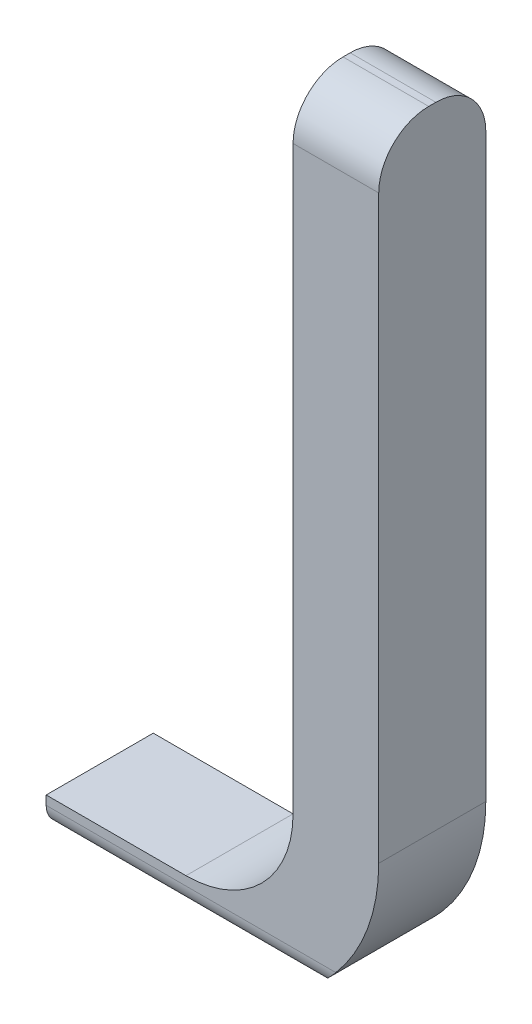
ISO-10303-21;
HEADER;
FILE_DESCRIPTION(('STEP AP214'),'2;1');
FILE_NAME('part.step','',(''),(''),'','','');
FILE_SCHEMA(('AUTOMOTIVE_DESIGN { 1 0 10303 214 1 1 1 1 }'));
ENDSEC;
DATA;
#1=APPLICATION_CONTEXT('core data for automotive mechanical design processes');
#2=APPLICATION_PROTOCOL_DEFINITION('international standard','automotive_design',2000,#1);
#3=PRODUCT_CONTEXT('',#1,'mechanical');
#4=PRODUCT('Part','Part','',(#3));
#5=PRODUCT_RELATED_PRODUCT_CATEGORY('part','',(#4));
#6=PRODUCT_DEFINITION_FORMATION('','',#4);
#7=PRODUCT_DEFINITION_CONTEXT('part definition',#1,'design');
#8=PRODUCT_DEFINITION('design','',#6,#7);
#9=PRODUCT_DEFINITION_SHAPE('','',#8);
#10=(LENGTH_UNIT() NAMED_UNIT(*) SI_UNIT(.MILLI.,.METRE.));
#11=(NAMED_UNIT(*) PLANE_ANGLE_UNIT() SI_UNIT($,.RADIAN.));
#12=(NAMED_UNIT(*) SI_UNIT($,.STERADIAN.) SOLID_ANGLE_UNIT());
#13=UNCERTAINTY_MEASURE_WITH_UNIT(LENGTH_MEASURE(1.E-05),#10,'distance_accuracy_value','');
#14=(GEOMETRIC_REPRESENTATION_CONTEXT(3) GLOBAL_UNCERTAINTY_ASSIGNED_CONTEXT((#13)) GLOBAL_UNIT_ASSIGNED_CONTEXT((#10,
#11,#12)) REPRESENTATION_CONTEXT('',''));
#15=CARTESIAN_POINT('',(0.,0.,0.));
#16=DIRECTION('',(0.,0.,1.));
#17=DIRECTION('',(1.,0.,0.));
#18=AXIS2_PLACEMENT_3D('',#15,#16,#17);
#19=CARTESIAN_POINT('',(81.8142284992855,422.253610620611,-137.52302838531));
#20=DIRECTION('',(-1.,0.,0.));
#21=DIRECTION('',(0.,-1.,0.));
#22=AXIS2_PLACEMENT_3D('',#19,#20,#21);
#23=PLANE('',#22);
#24=DIRECTION('',(0.,1.,0.));
#25=VECTOR('',#24,1.);
#26=CARTESIAN_POINT('',(81.8142284992855,422.253610620611,-15.));
#27=LINE('',#26,#25);
#28=CARTESIAN_POINT('',(81.8142284992855,420.99625130773,-15.));
#29=VERTEX_POINT('',#28);
#30=CARTESIAN_POINT('',(81.8142284992855,422.253610620611,-15.));
#31=VERTEX_POINT('',#30);
#32=EDGE_CURVE('E165',#29,#31,#27,.T.);
#33=ORIENTED_EDGE('',*,*,#32,.F.);
#34=CARTESIAN_POINT('',(81.8142284992855,420.99625130773,-12.));
#35=DIRECTION('',(-1.,0.,0.));
#36=DIRECTION('',(0.,-1.,0.));
#37=AXIS2_PLACEMENT_3D('',#34,#35,#36);
#38=CIRCLE('',#37,3.);
#39=CARTESIAN_POINT('',(81.8142284992855,418.87493096417,-14.1213203435596));
#40=VERTEX_POINT('',#39);
#41=EDGE_CURVE('E132',#29,#40,#38,.T.);
#42=ORIENTED_EDGE('',*,*,#41,.T.);
#43=DIRECTION('',(0.,-0.70710678118654,0.707106781186555));
#44=VECTOR('',#43,1.);
#45=CARTESIAN_POINT('',(81.8142284992855,412.253610620611,-7.50000000000001));
#46=LINE('',#45,#44);
#47=CARTESIAN_POINT('',(81.8142284992855,412.253610620611,-7.50000000000004));
#48=VERTEX_POINT('',#47);
#49=EDGE_CURVE('E128',#40,#48,#46,.T.);
#50=ORIENTED_EDGE('',*,*,#49,.T.);
#51=DIRECTION('',(0.,0.707106781186556,0.707106781186539));
#52=VECTOR('',#51,1.);
#53=CARTESIAN_POINT('',(81.8142284992855,419.753610620611,0.));
#54=LINE('',#53,#52);
#55=CARTESIAN_POINT('',(81.8142284992855,418.874930964171,-0.878679656440316));
#56=VERTEX_POINT('',#55);
#57=EDGE_CURVE('E130',#48,#56,#54,.T.);
#58=ORIENTED_EDGE('',*,*,#57,.T.);
#59=CARTESIAN_POINT('',(81.8142284992855,420.99625130773,-3.));
#60=DIRECTION('',(-1.,0.,0.));
#61=DIRECTION('',(0.,-1.,0.));
#62=AXIS2_PLACEMENT_3D('',#59,#60,#61);
#63=CIRCLE('',#62,3.);
#64=CARTESIAN_POINT('',(81.8142284992855,420.99625130773,0.));
#65=VERTEX_POINT('',#64);
#66=EDGE_CURVE('E49',#56,#65,#63,.T.);
#67=ORIENTED_EDGE('',*,*,#66,.T.);
#68=DIRECTION('',(0.,-1.,0.));
#69=VECTOR('',#68,1.);
#70=CARTESIAN_POINT('',(81.8142284992855,422.253610620611,0.));
#71=LINE('',#70,#69);
#72=CARTESIAN_POINT('',(81.8142284992855,422.253610620611,0.));
#73=VERTEX_POINT('',#72);
#74=EDGE_CURVE('E151',#73,#65,#71,.T.);
#75=ORIENTED_EDGE('',*,*,#74,.F.);
#76=DIRECTION('',(0.,0.,1.));
#77=VECTOR('',#76,1.);
#78=CARTESIAN_POINT('',(81.8142284992855,422.253610620611,-137.52302838531));
#79=LINE('',#78,#77);
#80=EDGE_CURVE('E156',#31,#73,#79,.T.);
#81=ORIENTED_EDGE('',*,*,#80,.F.);
#82=EDGE_LOOP('',(#33,#42,#50,#58,#67,#75,#81));
#83=FACE_BOUND('',#82,.T.);
#84=ADVANCED_FACE('F33',(#83),#23,.T.);
#85=CARTESIAN_POINT('',(81.8142284992855,422.253610620611,-137.52302838531));
#86=DIRECTION('',(0.,1.,0.));
#87=DIRECTION('',(0.,0.,1.));
#88=AXIS2_PLACEMENT_3D('',#85,#86,#87);
#89=PLANE('',#88);
#90=DIRECTION('',(1.,0.,0.));
#91=VECTOR('',#90,1.);
#92=CARTESIAN_POINT('',(81.8142284992855,422.253610620611,-15.));
#93=LINE('',#92,#91);
#94=CARTESIAN_POINT('',(101.396155955386,422.253610620611,-15.));
#95=VERTEX_POINT('',#94);
#96=EDGE_CURVE('E163',#31,#95,#93,.T.);
#97=ORIENTED_EDGE('',*,*,#96,.F.);
#98=ORIENTED_EDGE('',*,*,#80,.T.);
#99=DIRECTION('',(-1.,0.,0.));
#100=VECTOR('',#99,1.);
#101=CARTESIAN_POINT('',(81.8142284992855,422.253610620611,0.));
#102=LINE('',#101,#100);
#103=CARTESIAN_POINT('',(101.396155955386,422.253610620611,0.));
#104=VERTEX_POINT('',#103);
#105=EDGE_CURVE('E179',#104,#73,#102,.T.);
#106=ORIENTED_EDGE('',*,*,#105,.F.);
#107=DIRECTION('',(0.,0.,1.));
#108=VECTOR('',#107,1.);
#109=CARTESIAN_POINT('',(101.396155955386,422.253610620611,-137.52302838531));
#110=LINE('',#109,#108);
#111=EDGE_CURVE('E184',#95,#104,#110,.T.);
#112=ORIENTED_EDGE('',*,*,#111,.F.);
#113=EDGE_LOOP('',(#97,#98,#106,#112));
#114=FACE_BOUND('',#113,.T.);
#115=ADVANCED_FACE('F241',(#114),#89,.T.);
#116=CARTESIAN_POINT('',(101.396155955386,437.253610620611,-137.52302838531));
#117=DIRECTION('',(0.,0.,1.));
#118=DIRECTION('',(1.,0.,0.));
#119=AXIS2_PLACEMENT_3D('',#116,#117,#118);
#120=CYLINDRICAL_SURFACE('',#119,15.);
#121=CARTESIAN_POINT('',(101.396155955386,437.253610620611,-15.));
#122=DIRECTION('',(0.,0.,1.));
#123=DIRECTION('',(1.,0.,0.));
#124=AXIS2_PLACEMENT_3D('',#121,#122,#123);
#125=CIRCLE('',#124,15.);
#126=CARTESIAN_POINT('',(116.396155955386,437.253610620611,-15.));
#127=VERTEX_POINT('',#126);
#128=EDGE_CURVE('E161',#95,#127,#125,.T.);
#129=ORIENTED_EDGE('',*,*,#128,.F.);
#130=ORIENTED_EDGE('',*,*,#111,.T.);
#131=CARTESIAN_POINT('',(101.396155955386,437.253610620611,0.));
#132=DIRECTION('',(0.,0.,-1.));
#133=DIRECTION('',(1.,0.,0.));
#134=AXIS2_PLACEMENT_3D('',#131,#132,#133);
#135=CIRCLE('',#134,15.);
#136=CARTESIAN_POINT('',(116.396155955386,437.253610620611,0.));
#137=VERTEX_POINT('',#136);
#138=EDGE_CURVE('E176',#137,#104,#135,.T.);
#139=ORIENTED_EDGE('',*,*,#138,.F.);
#140=DIRECTION('',(0.,0.,1.));
#141=VECTOR('',#140,1.);
#142=CARTESIAN_POINT('',(116.396155955386,437.253610620611,-137.52302838531));
#143=LINE('',#142,#141);
#144=EDGE_CURVE('E186',#127,#137,#143,.T.);
#145=ORIENTED_EDGE('',*,*,#144,.F.);
#146=EDGE_LOOP('',(#129,#130,#139,#145));
#147=FACE_BOUND('',#146,.T.);
#148=ADVANCED_FACE('F286',(#147),#120,.F.);
#149=CARTESIAN_POINT('',(116.396155955386,437.253610620611,-137.52302838531));
#150=DIRECTION('',(-1.,0.,0.));
#151=DIRECTION('',(0.,0.,1.));
#152=AXIS2_PLACEMENT_3D('',#149,#150,#151);
#153=PLANE('',#152);
#154=DIRECTION('',(0.,0.,1.));
#155=VECTOR('',#154,1.);
#156=CARTESIAN_POINT('',(116.396155955386,525.576232012732,-137.52302838531));
#157=LINE('',#156,#155);
#158=CARTESIAN_POINT('',(116.396155955386,525.576232012732,-8.00000000000001));
#159=VERTEX_POINT('',#158);
#160=CARTESIAN_POINT('',(116.396155955386,525.576232012732,-7.00000000000001));
#161=VERTEX_POINT('',#160);
#162=EDGE_CURVE('E189',#159,#161,#157,.T.);
#163=ORIENTED_EDGE('',*,*,#162,.F.);
#164=CARTESIAN_POINT('',(116.396155955386,518.576232012732,-8.));
#165=DIRECTION('',(-1.,0.,0.));
#166=DIRECTION('',(0.,0.,1.));
#167=AXIS2_PLACEMENT_3D('',#164,#165,#166);
#168=CIRCLE('',#167,7.);
#169=CARTESIAN_POINT('',(116.396155955386,518.576232012732,-15.));
#170=VERTEX_POINT('',#169);
#171=EDGE_CURVE('E209',#159,#170,#168,.T.);
#172=ORIENTED_EDGE('',*,*,#171,.T.);
#173=DIRECTION('',(0.,1.,0.));
#174=VECTOR('',#173,1.);
#175=CARTESIAN_POINT('',(116.396155955386,437.253610620611,-15.));
#176=LINE('',#175,#174);
#177=EDGE_CURVE('E158',#127,#170,#176,.T.);
#178=ORIENTED_EDGE('',*,*,#177,.F.);
#179=ORIENTED_EDGE('',*,*,#144,.T.);
#180=DIRECTION('',(0.,-1.,0.));
#181=VECTOR('',#180,1.);
#182=CARTESIAN_POINT('',(116.396155955386,437.253610620611,0.));
#183=LINE('',#182,#181);
#184=CARTESIAN_POINT('',(116.396155955386,518.576232012732,0.));
#185=VERTEX_POINT('',#184);
#186=EDGE_CURVE('E174',#185,#137,#183,.T.);
#187=ORIENTED_EDGE('',*,*,#186,.F.);
#188=CARTESIAN_POINT('',(116.396155955386,518.576232012732,-7.));
#189=DIRECTION('',(-1.,0.,0.));
#190=DIRECTION('',(0.,0.,1.));
#191=AXIS2_PLACEMENT_3D('',#188,#189,#190);
#192=CIRCLE('',#191,7.);
#193=EDGE_CURVE('E207',#185,#161,#192,.T.);
#194=ORIENTED_EDGE('',*,*,#193,.T.);
#195=EDGE_LOOP('',(#163,#172,#178,#179,#187,#194));
#196=FACE_BOUND('',#195,.T.);
#197=ADVANCED_FACE('F291',(#196),#153,.T.);
#198=CARTESIAN_POINT('',(116.396155955386,525.576232012732,-137.52302838531));
#199=DIRECTION('',(0.,1.,0.));
#200=DIRECTION('',(0.,0.,1.));
#201=AXIS2_PLACEMENT_3D('',#198,#199,#200);
#202=PLANE('',#201);
#203=DIRECTION('',(0.,0.,1.));
#204=VECTOR('',#203,1.);
#205=CARTESIAN_POINT('',(128.396155955386,525.576232012732,-137.52302838531));
#206=LINE('',#205,#204);
#207=CARTESIAN_POINT('',(128.396155955386,525.576232012732,-8.00000000000001));
#208=VERTEX_POINT('',#207);
#209=CARTESIAN_POINT('',(128.396155955386,525.576232012732,-7.00000000000001));
#210=VERTEX_POINT('',#209);
#211=EDGE_CURVE('E192',#208,#210,#206,.T.);
#212=ORIENTED_EDGE('',*,*,#211,.F.);
#213=DIRECTION('',(1.,0.,0.));
#214=VECTOR('',#213,1.);
#215=CARTESIAN_POINT('',(116.396155955386,525.576232012732,-8.));
#216=LINE('',#215,#214);
#217=EDGE_CURVE('E205',#208,#159,#216,.F.);
#218=ORIENTED_EDGE('',*,*,#217,.T.);
#219=ORIENTED_EDGE('',*,*,#162,.T.);
#220=DIRECTION('',(-1.,0.,0.));
#221=VECTOR('',#220,1.);
#222=CARTESIAN_POINT('',(116.396155955386,525.576232012732,-7.00000000000001));
#223=LINE('',#222,#221);
#224=EDGE_CURVE('E203',#161,#210,#223,.F.);
#225=ORIENTED_EDGE('',*,*,#224,.T.);
#226=EDGE_LOOP('',(#212,#218,#219,#225));
#227=FACE_BOUND('',#226,.T.);
#228=ADVANCED_FACE('F295',(#227),#202,.T.);
#229=CARTESIAN_POINT('',(128.396155955386,525.576232012732,-137.52302838531));
#230=DIRECTION('',(1.,0.,0.));
#231=DIRECTION('',(0.,0.,-1.));
#232=AXIS2_PLACEMENT_3D('',#229,#230,#231);
#233=PLANE('',#232);
#234=DIRECTION('',(0.,-1.,0.));
#235=VECTOR('',#234,1.);
#236=CARTESIAN_POINT('',(128.396155955386,525.576232012732,-15.));
#237=LINE('',#236,#235);
#238=CARTESIAN_POINT('',(128.396155955386,518.576232012732,-15.));
#239=VERTEX_POINT('',#238);
#240=CARTESIAN_POINT('',(128.396155955386,437.253610620611,-15.));
#241=VERTEX_POINT('',#240);
#242=EDGE_CURVE('E155',#239,#241,#237,.T.);
#243=ORIENTED_EDGE('',*,*,#242,.F.);
#244=CARTESIAN_POINT('',(128.396155955386,518.576232012732,-8.));
#245=DIRECTION('',(1.,0.,0.));
#246=DIRECTION('',(0.,0.,-1.));
#247=AXIS2_PLACEMENT_3D('',#244,#245,#246);
#248=CIRCLE('',#247,7.);
#249=EDGE_CURVE('E201',#239,#208,#248,.T.);
#250=ORIENTED_EDGE('',*,*,#249,.T.);
#251=ORIENTED_EDGE('',*,*,#211,.T.);
#252=CARTESIAN_POINT('',(128.396155955386,518.576232012732,-7.));
#253=DIRECTION('',(1.,0.,0.));
#254=DIRECTION('',(0.,0.,-1.));
#255=AXIS2_PLACEMENT_3D('',#252,#253,#254);
#256=CIRCLE('',#255,7.);
#257=CARTESIAN_POINT('',(128.396155955386,518.576232012732,0.));
#258=VERTEX_POINT('',#257);
#259=EDGE_CURVE('E199',#210,#258,#256,.T.);
#260=ORIENTED_EDGE('',*,*,#259,.T.);
#261=DIRECTION('',(0.,1.,0.));
#262=VECTOR('',#261,1.);
#263=CARTESIAN_POINT('',(128.396155955386,525.576232012732,0.));
#264=LINE('',#263,#262);
#265=CARTESIAN_POINT('',(128.396155955386,437.253610620611,0.));
#266=VERTEX_POINT('',#265);
#267=EDGE_CURVE('E171',#266,#258,#264,.T.);
#268=ORIENTED_EDGE('',*,*,#267,.F.);
#269=DIRECTION('',(0.,0.,1.));
#270=VECTOR('',#269,1.);
#271=CARTESIAN_POINT('',(128.396155955386,437.253610620611,-137.52302838531));
#272=LINE('',#271,#270);
#273=EDGE_CURVE('E182',#241,#266,#272,.T.);
#274=ORIENTED_EDGE('',*,*,#273,.F.);
#275=EDGE_LOOP('',(#243,#250,#251,#260,#268,#274));
#276=FACE_BOUND('',#275,.T.);
#277=ADVANCED_FACE('F235',(#276),#233,.T.);
#278=CARTESIAN_POINT('',(103.396155955386,437.253610620611,-137.52302838531));
#279=DIRECTION('',(0.,0.,1.));
#280=DIRECTION('',(1.,0.,0.));
#281=AXIS2_PLACEMENT_3D('',#278,#279,#280);
#282=CYLINDRICAL_SURFACE('',#281,25.);
#283=CARTESIAN_POINT('',(103.396155955386,437.253610620611,-32.5000000000006));
#284=DIRECTION('',(0.,0.707106781186555,0.70710678118654));
#285=DIRECTION('',(0.,-0.70710678118654,0.707106781186555));
#286=AXIS2_PLACEMENT_3D('',#283,#284,#285);
#287=ELLIPSE('',#286,35.3553390593278,25.);
#288=CARTESIAN_POINT('',(120.343844118848,418.87493096417,-14.1213203435596));
#289=VERTEX_POINT('',#288);
#290=CARTESIAN_POINT('',(103.396155955386,412.253610620611,-7.5));
#291=VERTEX_POINT('',#290);
#292=EDGE_CURVE('E142',#289,#291,#287,.F.);
#293=ORIENTED_EDGE('',*,*,#292,.F.);
#294=CARTESIAN_POINT('',(120.343844118848,418.87493096417,-14.1213203435596));
#295=CARTESIAN_POINT('',(120.422091551165,418.94707406357,-14.1934144614544));
#296=CARTESIAN_POINT('',(120.50212729168,419.021813648313,-14.2608483073836));
#297=CARTESIAN_POINT('',(120.664792361866,419.175817361876,-14.3866186818955));
#298=CARTESIAN_POINT('',(120.747419430572,419.255077593239,-14.4449628898315));
#299=CARTESIAN_POINT('',(120.912678346348,419.415883894951,-14.5517729762806));
#300=CARTESIAN_POINT('',(120.995274138985,419.497347792709,-14.6004195298351));
#301=CARTESIAN_POINT('',(121.161524265649,419.663684191045,-14.6894551441593));
#302=CARTESIAN_POINT('',(121.245178893337,419.748557652092,-14.7298418583546));
#303=CARTESIAN_POINT('',(121.416768399598,419.925212895659,-14.8040084744509));
#304=CARTESIAN_POINT('',(121.504725548453,420.017133467035,-14.8374063405176));
#305=CARTESIAN_POINT('',(121.680592409751,420.20380610309,-14.8950943683913));
#306=CARTESIAN_POINT('',(121.768502126953,420.298557788719,-14.9193857435899));
#307=CARTESIAN_POINT('',(121.945732350175,420.492619185792,-14.9591193133807));
#308=CARTESIAN_POINT('',(122.03504049277,420.591983436161,-14.9743516670095));
#309=CARTESIAN_POINT('',(122.212577555019,420.792737261583,-14.9947857189091));
#310=CARTESIAN_POINT('',(122.30080613911,420.894127441808,-14.999984373324));
#311=CARTESIAN_POINT('',(122.388213984254,420.99625130773,-15.));
#312=B_SPLINE_CURVE_WITH_KNOTS('',3,(#294,#295,#296,#297,#298,#299,#300,#301,#302,#303,#304,
#305,#306,#307,#308,#309,#310,#311),.UNSPECIFIED.,.F.,.F.,(4,2,2,2,2,2,2,2,4),(0.,
0.38542585859057,0.770524304530041,1.14758954697053,1.52476176319408,1.91901510669598,
2.31321589934118,2.71622421047217,3.11935476032534),.UNSPECIFIED.);
#313=CARTESIAN_POINT('',(122.388213984254,420.99625130773,-15.));
#314=VERTEX_POINT('',#313);
#315=EDGE_CURVE('E223',#289,#314,#312,.T.);
#316=ORIENTED_EDGE('',*,*,#315,.T.);
#317=CARTESIAN_POINT('',(103.396155955386,437.253610620611,-15.));
#318=DIRECTION('',(0.,0.,1.));
#319=DIRECTION('',(1.,0.,0.));
#320=AXIS2_PLACEMENT_3D('',#317,#318,#319);
#321=CIRCLE('',#320,25.);
#322=EDGE_CURVE('E152',#241,#314,#321,.F.);
#323=ORIENTED_EDGE('',*,*,#322,.F.);
#324=ORIENTED_EDGE('',*,*,#273,.T.);
#325=CARTESIAN_POINT('',(103.396155955386,437.253610620611,0.));
#326=DIRECTION('',(0.,0.,1.));
#327=DIRECTION('',(1.,0.,0.));
#328=AXIS2_PLACEMENT_3D('',#325,#326,#327);
#329=CIRCLE('',#328,25.);
#330=CARTESIAN_POINT('',(122.388213984254,420.99625130773,0.));
#331=VERTEX_POINT('',#330);
#332=EDGE_CURVE('E169',#331,#266,#329,.T.);
#333=ORIENTED_EDGE('',*,*,#332,.F.);
#334=CARTESIAN_POINT('',(122.388213984254,420.99625130773,0.));
#335=CARTESIAN_POINT('',(122.304881376789,420.898896373751,-1.7211894640786E-05));
#336=CARTESIAN_POINT('',(122.220845912823,420.802246638457,-0.00473827235102295));
#337=CARTESIAN_POINT('',(122.051777846089,420.610772334439,-0.0233107320381378));
#338=CARTESIAN_POINT('',(121.966745620989,420.515947108232,-0.037158776340752));
#339=CARTESIAN_POINT('',(121.714311444924,420.238718551684,-0.0912041156420113));
#340=CARTESIAN_POINT('',(121.545988817463,420.059384167755,-0.143934864961261));
#341=CARTESIAN_POINT('',(121.290518123,419.794859639435,-0.249311856634872));
#342=CARTESIAN_POINT('',(121.202726330052,419.705351736278,-0.29014129964349));
#343=CARTESIAN_POINT('',(121.02818442759,419.529986768273,-0.380876989631308));
#344=CARTESIAN_POINT('',(120.941434073168,419.444128832515,-0.430781056169584));
#345=CARTESIAN_POINT('',(120.767782787667,419.274689895902,-0.540998614992854));
#346=CARTESIAN_POINT('',(120.680921593347,419.19120229232,-0.601519320580185));
#347=CARTESIAN_POINT('',(120.510000905117,419.029167475093,-0.732538794598721));
#348=CARTESIAN_POINT('',(120.425943873908,418.950624552975,-0.803046062582943));
#349=CARTESIAN_POINT('',(120.343844118848,418.874930964171,-0.878679656440309));
#350=B_SPLINE_CURVE_WITH_KNOTS('',3,(#334,#335,#336,#337,#338,#339,#340,#341,#342,#343,#344,
#345,#346,#347,#348,#349),.UNSPECIFIED.,.F.,.F.,(4,2,2,2,2,2,2,4),(0.,0.384213151240646,
0.768285150797808,1.5200595974459,1.91534954546888,2.3105446388446,2.71454774935435,
3.11889679605043),.UNSPECIFIED.);
#351=CARTESIAN_POINT('',(120.343844118848,418.874930964171,-0.878679656440333));
#352=VERTEX_POINT('',#351);
#353=EDGE_CURVE('E216',#331,#352,#350,.T.);
#354=ORIENTED_EDGE('',*,*,#353,.T.);
#355=CARTESIAN_POINT('',(103.396155955386,437.253610620611,17.4999999999994));
#356=DIRECTION('',(0.,0.707106781186539,-0.707106781186556));
#357=DIRECTION('',(0.,0.707106781186556,0.707106781186539));
#358=AXIS2_PLACEMENT_3D('',#355,#356,#357);
#359=ELLIPSE('',#358,35.355339059327,25.);
#360=EDGE_CURVE('E149',#291,#352,#359,.F.);
#361=ORIENTED_EDGE('',*,*,#360,.F.);
#362=EDGE_LOOP('',(#293,#316,#323,#324,#333,#354,#361));
#363=FACE_BOUND('',#362,.T.);
#364=ADVANCED_FACE('F229',(#363),#282,.T.);
#365=CARTESIAN_POINT('',(103.396155955386,437.253610620611,0.));
#366=DIRECTION('',(0.,0.,1.));
#367=DIRECTION('',(1.,0.,0.));
#368=AXIS2_PLACEMENT_3D('',#365,#366,#367);
#369=PLANE('',#368);
#370=ORIENTED_EDGE('',*,*,#74,.T.);
#371=DIRECTION('',(1.,0.,0.));
#372=VECTOR('',#371,1.);
#373=CARTESIAN_POINT('',(121.249727026744,420.99625130773,0.));
#374=LINE('',#373,#372);
#375=EDGE_CURVE('E42',#65,#331,#374,.T.);
#376=ORIENTED_EDGE('',*,*,#375,.T.);
#377=ORIENTED_EDGE('',*,*,#332,.T.);
#378=ORIENTED_EDGE('',*,*,#267,.T.);
#379=DIRECTION('',(-1.,0.,0.));
#380=VECTOR('',#379,1.);
#381=CARTESIAN_POINT('',(103.396155955386,518.576232012732,0.));
#382=LINE('',#381,#380);
#383=EDGE_CURVE('E211',#258,#185,#382,.T.);
#384=ORIENTED_EDGE('',*,*,#383,.T.);
#385=ORIENTED_EDGE('',*,*,#186,.T.);
#386=ORIENTED_EDGE('',*,*,#138,.T.);
#387=ORIENTED_EDGE('',*,*,#105,.T.);
#388=EDGE_LOOP('',(#370,#376,#377,#378,#384,#385,#386,#387));
#389=FACE_BOUND('',#388,.T.);
#390=ADVANCED_FACE('F234',(#389),#369,.T.);
#391=CARTESIAN_POINT('',(0.,0.,-15.));
#392=DIRECTION('',(0.,0.,1.));
#393=DIRECTION('',(1.,0.,0.));
#394=AXIS2_PLACEMENT_3D('',#391,#392,#393);
#395=PLANE('',#394);
#396=ORIENTED_EDGE('',*,*,#322,.T.);
#397=DIRECTION('',(1.,0.,0.));
#398=VECTOR('',#397,1.);
#399=CARTESIAN_POINT('',(0.,420.99625130773,-15.));
#400=LINE('',#399,#398);
#401=EDGE_CURVE('E261',#314,#29,#400,.F.);
#402=ORIENTED_EDGE('',*,*,#401,.T.);
#403=ORIENTED_EDGE('',*,*,#32,.T.);
#404=ORIENTED_EDGE('',*,*,#96,.T.);
#405=ORIENTED_EDGE('',*,*,#128,.T.);
#406=ORIENTED_EDGE('',*,*,#177,.T.);
#407=DIRECTION('',(1.,0.,0.));
#408=VECTOR('',#407,1.);
#409=CARTESIAN_POINT('',(128.396155955386,518.576232012732,-15.));
#410=LINE('',#409,#408);
#411=EDGE_CURVE('E167',#170,#239,#410,.T.);
#412=ORIENTED_EDGE('',*,*,#411,.T.);
#413=ORIENTED_EDGE('',*,*,#242,.T.);
#414=EDGE_LOOP('',(#396,#402,#403,#404,#405,#406,#412,#413));
#415=FACE_BOUND('',#414,.T.);
#416=ADVANCED_FACE('F246',(#415),#395,.F.);
#417=CARTESIAN_POINT('',(0.,518.576232012732,-8.));
#418=DIRECTION('',(-1.,0.,0.));
#419=DIRECTION('',(0.,0.,1.));
#420=AXIS2_PLACEMENT_3D('',#417,#418,#419);
#421=CYLINDRICAL_SURFACE('',#420,7.);
#422=ORIENTED_EDGE('',*,*,#171,.F.);
#423=ORIENTED_EDGE('',*,*,#217,.F.);
#424=ORIENTED_EDGE('',*,*,#249,.F.);
#425=ORIENTED_EDGE('',*,*,#411,.F.);
#426=EDGE_LOOP('',(#422,#423,#424,#425));
#427=FACE_BOUND('',#426,.T.);
#428=ADVANCED_FACE('F242',(#427),#421,.T.);
#429=CARTESIAN_POINT('',(103.396155955386,518.576232012732,-7.));
#430=DIRECTION('',(-1.,0.,0.));
#431=DIRECTION('',(0.,0.,1.));
#432=AXIS2_PLACEMENT_3D('',#429,#430,#431);
#433=CYLINDRICAL_SURFACE('',#432,7.);
#434=ORIENTED_EDGE('',*,*,#259,.F.);
#435=ORIENTED_EDGE('',*,*,#224,.F.);
#436=ORIENTED_EDGE('',*,*,#193,.F.);
#437=ORIENTED_EDGE('',*,*,#383,.F.);
#438=EDGE_LOOP('',(#434,#435,#436,#437));
#439=FACE_BOUND('',#438,.T.);
#440=ADVANCED_FACE('F245',(#439),#433,.T.);
#441=CARTESIAN_POINT('',(63.1762612083956,412.253610620611,-7.5));
#442=DIRECTION('',(0.,0.707106781186555,0.70710678118654));
#443=DIRECTION('',(0.,-0.70710678118654,0.707106781186555));
#444=AXIS2_PLACEMENT_3D('',#441,#442,#443);
#445=PLANE('',#444);
#446=ORIENTED_EDGE('',*,*,#49,.F.);
#447=DIRECTION('',(1.,0.,0.));
#448=VECTOR('',#447,1.);
#449=CARTESIAN_POINT('',(63.1762612083956,418.87493096417,-14.1213203435596));
#450=LINE('',#449,#448);
#451=EDGE_CURVE('E214',#40,#289,#450,.T.);
#452=ORIENTED_EDGE('',*,*,#451,.T.);
#453=ORIENTED_EDGE('',*,*,#292,.T.);
#454=DIRECTION('',(1.,0.,0.));
#455=VECTOR('',#454,1.);
#456=CARTESIAN_POINT('',(63.1762612083956,412.253610620611,-7.5));
#457=LINE('',#456,#455);
#458=EDGE_CURVE('E137',#48,#291,#457,.T.);
#459=ORIENTED_EDGE('',*,*,#458,.F.);
#460=EDGE_LOOP('',(#446,#452,#453,#459));
#461=FACE_BOUND('',#460,.T.);
#462=ADVANCED_FACE('F144',(#461),#445,.F.);
#463=CARTESIAN_POINT('',(63.1762612083956,419.753610620611,0.));
#464=DIRECTION('',(0.,0.707106781186539,-0.707106781186556));
#465=DIRECTION('',(0.,0.707106781186556,0.707106781186539));
#466=AXIS2_PLACEMENT_3D('',#463,#464,#465);
#467=PLANE('',#466);
#468=ORIENTED_EDGE('',*,*,#360,.T.);
#469=DIRECTION('',(1.,0.,0.));
#470=VECTOR('',#469,1.);
#471=CARTESIAN_POINT('',(81.8142284992855,418.874930964171,-0.878679656440331));
#472=LINE('',#471,#470);
#473=EDGE_CURVE('E11',#352,#56,#472,.F.);
#474=ORIENTED_EDGE('',*,*,#473,.T.);
#475=ORIENTED_EDGE('',*,*,#57,.F.);
#476=ORIENTED_EDGE('',*,*,#458,.T.);
#477=EDGE_LOOP('',(#468,#474,#475,#476));
#478=FACE_BOUND('',#477,.T.);
#479=ADVANCED_FACE('F140',(#478),#467,.F.);
#480=CARTESIAN_POINT('',(63.1762612083956,420.99625130773,-12.));
#481=DIRECTION('',(1.,0.,0.));
#482=DIRECTION('',(0.,0.,-1.));
#483=AXIS2_PLACEMENT_3D('',#480,#481,#482);
#484=CYLINDRICAL_SURFACE('',#483,3.);
#485=ORIENTED_EDGE('',*,*,#41,.F.);
#486=ORIENTED_EDGE('',*,*,#401,.F.);
#487=ORIENTED_EDGE('',*,*,#315,.F.);
#488=ORIENTED_EDGE('',*,*,#451,.F.);
#489=EDGE_LOOP('',(#485,#486,#487,#488));
#490=FACE_BOUND('',#489,.T.);
#491=ADVANCED_FACE('F250',(#490),#484,.T.);
#492=CARTESIAN_POINT('',(103.396155955386,420.99625130773,-3.));
#493=DIRECTION('',(-1.,0.,0.));
#494=DIRECTION('',(0.,0.,1.));
#495=AXIS2_PLACEMENT_3D('',#492,#493,#494);
#496=CYLINDRICAL_SURFACE('',#495,3.);
#497=ORIENTED_EDGE('',*,*,#66,.F.);
#498=ORIENTED_EDGE('',*,*,#473,.F.);
#499=ORIENTED_EDGE('',*,*,#353,.F.);
#500=ORIENTED_EDGE('',*,*,#375,.F.);
#501=EDGE_LOOP('',(#497,#498,#499,#500));
#502=FACE_BOUND('',#501,.T.);
#503=ADVANCED_FACE('F35',(#502),#496,.T.);
#504=CLOSED_SHELL('',(#84,#115,#148,#197,#228,#277,#364,#390,#416,#428,#440,#462,#479,#491,#503));
#505=MANIFOLD_SOLID_BREP('B2',#504);
#506=ADVANCED_BREP_SHAPE_REPRESENTATION('',(#18,#505),#14);
#507=SHAPE_DEFINITION_REPRESENTATION(#9,#506);
ENDSEC;
END-ISO-10303-21;
